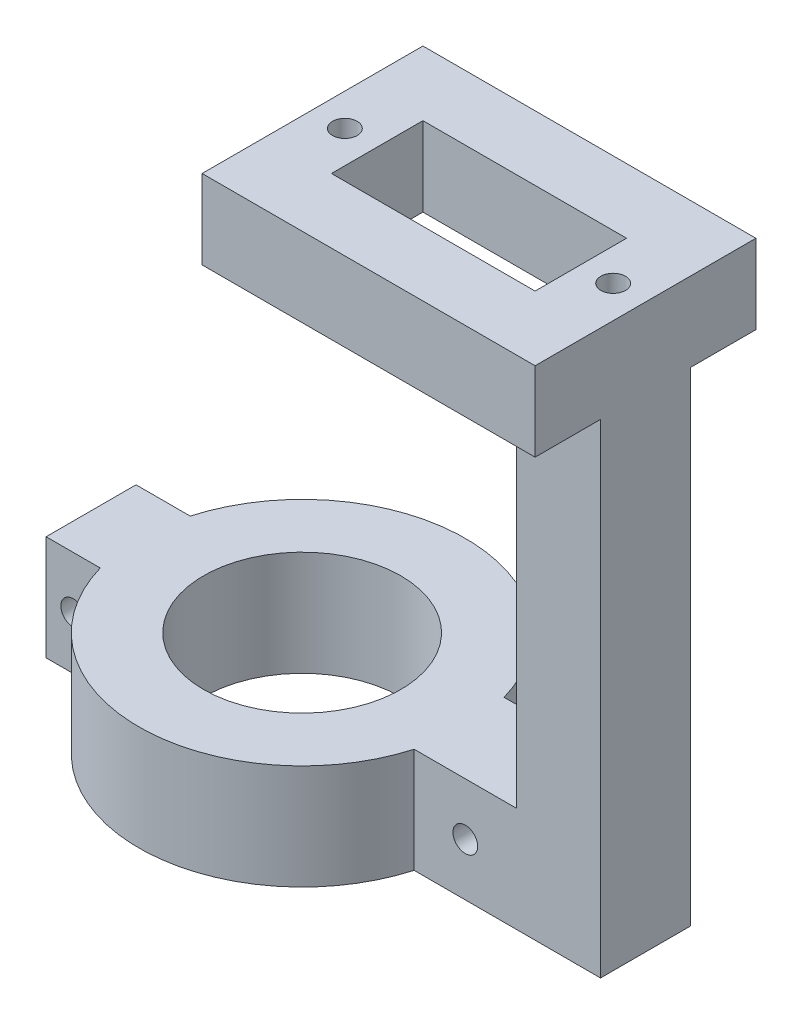
ISO-10303-21;
HEADER;
FILE_DESCRIPTION(('STEP AP214'),'2;1');
FILE_NAME('part.step','',(''),(''),'','','');
FILE_SCHEMA(('AUTOMOTIVE_DESIGN { 1 0 10303 214 1 1 1 1 }'));
ENDSEC;
DATA;
#1=APPLICATION_CONTEXT('core data for automotive mechanical design processes');
#2=APPLICATION_PROTOCOL_DEFINITION('international standard','automotive_design',2000,#1);
#3=PRODUCT_CONTEXT('',#1,'mechanical');
#4=PRODUCT('Part','Part','',(#3));
#5=PRODUCT_RELATED_PRODUCT_CATEGORY('part','',(#4));
#6=PRODUCT_DEFINITION_FORMATION('','',#4);
#7=PRODUCT_DEFINITION_CONTEXT('part definition',#1,'design');
#8=PRODUCT_DEFINITION('design','',#6,#7);
#9=PRODUCT_DEFINITION_SHAPE('','',#8);
#10=(LENGTH_UNIT() NAMED_UNIT(*) SI_UNIT(.MILLI.,.METRE.));
#11=(NAMED_UNIT(*) PLANE_ANGLE_UNIT() SI_UNIT($,.RADIAN.));
#12=(NAMED_UNIT(*) SI_UNIT($,.STERADIAN.) SOLID_ANGLE_UNIT());
#13=UNCERTAINTY_MEASURE_WITH_UNIT(LENGTH_MEASURE(1.E-05),#10,'distance_accuracy_value','');
#14=(GEOMETRIC_REPRESENTATION_CONTEXT(3) GLOBAL_UNCERTAINTY_ASSIGNED_CONTEXT((#13)) GLOBAL_UNIT_ASSIGNED_CONTEXT((#10,
#11,#12)) REPRESENTATION_CONTEXT('',''));
#15=CARTESIAN_POINT('',(0.,0.,0.));
#16=DIRECTION('',(0.,0.,1.));
#17=DIRECTION('',(1.,0.,0.));
#18=AXIS2_PLACEMENT_3D('',#15,#16,#17);
#19=CARTESIAN_POINT('',(-27.351479578733,-58.59,0.));
#20=DIRECTION('',(0.,-1.,0.));
#21=DIRECTION('',(0.,0.,-1.));
#22=AXIS2_PLACEMENT_3D('',#19,#20,#21);
#23=CYLINDRICAL_SURFACE('',#22,25.25);
#24=CARTESIAN_POINT('',(-27.351479578733,-74.82,0.));
#25=DIRECTION('',(0.,-1.,0.));
#26=DIRECTION('',(1.,0.,0.));
#27=AXIS2_PLACEMENT_3D('',#24,#25,#26);
#28=CIRCLE('',#27,25.25);
#29=CARTESIAN_POINT('',(-51.6247256533725,-74.82,-6.955));
#30=VERTEX_POINT('',#29);
#31=CARTESIAN_POINT('',(-3.07823350409353,-74.82,-6.955));
#32=VERTEX_POINT('',#31);
#33=EDGE_CURVE('E84',#30,#32,#28,.T.);
#34=ORIENTED_EDGE('',*,*,#33,.F.);
#35=DIRECTION('',(0.,-1.,0.));
#36=VECTOR('',#35,1.);
#37=CARTESIAN_POINT('',(-51.6247256533725,-58.59,-6.955));
#38=LINE('',#37,#36);
#39=CARTESIAN_POINT('',(-51.6247256533725,-58.59,-6.955));
#40=VERTEX_POINT('',#39);
#41=EDGE_CURVE('E12',#30,#40,#38,.F.);
#42=ORIENTED_EDGE('',*,*,#41,.T.);
#43=CARTESIAN_POINT('',(-27.351479578733,-58.59,0.));
#44=DIRECTION('',(0.,-1.,0.));
#45=DIRECTION('',(1.,0.,0.));
#46=AXIS2_PLACEMENT_3D('',#43,#44,#45);
#47=CIRCLE('',#46,25.25);
#48=CARTESIAN_POINT('',(-3.07823350409353,-58.59,-6.95500000000001));
#49=VERTEX_POINT('',#48);
#50=EDGE_CURVE('E202',#40,#49,#47,.T.);
#51=ORIENTED_EDGE('',*,*,#50,.T.);
#52=DIRECTION('',(0.,-1.,0.));
#53=VECTOR('',#52,1.);
#54=CARTESIAN_POINT('',(-3.07823350409353,-58.59,-6.955));
#55=LINE('',#54,#53);
#56=EDGE_CURVE('E246',#32,#49,#55,.F.);
#57=ORIENTED_EDGE('',*,*,#56,.F.);
#58=EDGE_LOOP('',(#34,#42,#51,#57));
#59=FACE_BOUND('',#58,.T.);
#60=ADVANCED_FACE('F63',(#59),#23,.T.);
#61=CARTESIAN_POINT('',(-3.07823350409353,-58.59,6.95499999999999));
#62=VERTEX_POINT('',#61);
#63=CARTESIAN_POINT('',(-51.6247256533725,-58.59,6.955));
#64=VERTEX_POINT('',#63);
#65=EDGE_CURVE('E238',#62,#64,#47,.T.);
#66=ORIENTED_EDGE('',*,*,#65,.T.);
#67=DIRECTION('',(0.,-1.,0.));
#68=VECTOR('',#67,1.);
#69=CARTESIAN_POINT('',(-51.6247256533725,-58.59,6.955));
#70=LINE('',#69,#68);
#71=CARTESIAN_POINT('',(-51.6247256533725,-74.82,6.955));
#72=VERTEX_POINT('',#71);
#73=EDGE_CURVE('E72',#64,#72,#70,.T.);
#74=ORIENTED_EDGE('',*,*,#73,.T.);
#75=CARTESIAN_POINT('',(-3.07823350409353,-74.82,6.955));
#76=VERTEX_POINT('',#75);
#77=EDGE_CURVE('E242',#76,#72,#28,.T.);
#78=ORIENTED_EDGE('',*,*,#77,.F.);
#79=DIRECTION('',(0.,-1.,0.));
#80=VECTOR('',#79,1.);
#81=CARTESIAN_POINT('',(-3.07823350409353,-58.59,6.955));
#82=LINE('',#81,#80);
#83=EDGE_CURVE('E241',#62,#76,#82,.T.);
#84=ORIENTED_EDGE('',*,*,#83,.F.);
#85=EDGE_LOOP('',(#66,#74,#78,#84));
#86=FACE_BOUND('',#85,.T.);
#87=ADVANCED_FACE('F382',(#86),#23,.T.);
#88=CARTESIAN_POINT('',(12.75,-74.82,6.955));
#89=DIRECTION('',(1.,0.,0.));
#90=DIRECTION('',(0.,0.,-1.));
#91=AXIS2_PLACEMENT_3D('',#88,#89,#90);
#92=PLANE('',#91);
#93=DIRECTION('',(0.,0.,-1.));
#94=VECTOR('',#93,1.);
#95=CARTESIAN_POINT('',(12.75,-58.59,-6.955));
#96=LINE('',#95,#94);
#97=CARTESIAN_POINT('',(12.75,-58.59,6.955));
#98=VERTEX_POINT('',#97);
#99=CARTESIAN_POINT('',(12.75,-58.59,-6.955));
#100=VERTEX_POINT('',#99);
#101=EDGE_CURVE('E249',#98,#100,#96,.T.);
#102=ORIENTED_EDGE('',*,*,#101,.F.);
#103=DIRECTION('',(0.,1.,0.));
#104=VECTOR('',#103,1.);
#105=CARTESIAN_POINT('',(12.75,-74.82,6.955));
#106=LINE('',#105,#104);
#107=CARTESIAN_POINT('',(12.75,0.,6.955));
#108=VERTEX_POINT('',#107);
#109=EDGE_CURVE('E280',#98,#108,#106,.T.);
#110=ORIENTED_EDGE('',*,*,#109,.T.);
#111=DIRECTION('',(0.,0.,-1.));
#112=VECTOR('',#111,1.);
#113=CARTESIAN_POINT('',(12.75,0.,6.955));
#114=LINE('',#113,#112);
#115=CARTESIAN_POINT('',(12.75,0.,-6.955));
#116=VERTEX_POINT('',#115);
#117=EDGE_CURVE('E270',#108,#116,#114,.T.);
#118=ORIENTED_EDGE('',*,*,#117,.T.);
#119=DIRECTION('',(0.,1.,0.));
#120=VECTOR('',#119,1.);
#121=CARTESIAN_POINT('',(12.75,-74.82,-6.955));
#122=LINE('',#121,#120);
#123=EDGE_CURVE('E278',#100,#116,#122,.T.);
#124=ORIENTED_EDGE('',*,*,#123,.F.);
#125=EDGE_LOOP('',(#102,#110,#118,#124));
#126=FACE_BOUND('',#125,.T.);
#127=ADVANCED_FACE('F387',(#126),#92,.F.);
#128=CARTESIAN_POINT('',(0.,0.,0.));
#129=DIRECTION('',(0.,1.,0.));
#130=DIRECTION('',(0.,0.,1.));
#131=AXIS2_PLACEMENT_3D('',#128,#129,#130);
#132=PLANE('',#131);
#133=CARTESIAN_POINT('',(-20.75,0.,0.));
#134=DIRECTION('',(0.,1.,0.));
#135=DIRECTION('',(0.,0.,1.));
#136=AXIS2_PLACEMENT_3D('',#133,#134,#135);
#137=CIRCLE('',#136,1.91);
#138=CARTESIAN_POINT('',(-20.75,0.,1.91));
#139=VERTEX_POINT('',#138);
#140=EDGE_CURVE('E292',#139,#139,#137,.T.);
#141=ORIENTED_EDGE('',*,*,#140,.T.);
#142=EDGE_LOOP('',(#141));
#143=FACE_BOUND('',#142,.T.);
#144=DIRECTION('',(1.,0.,0.));
#145=VECTOR('',#144,1.);
#146=CARTESIAN_POINT('',(12.75,0.,-6.955));
#147=LINE('',#146,#145);
#148=CARTESIAN_POINT('',(15.75,0.,-6.955));
#149=VERTEX_POINT('',#148);
#150=CARTESIAN_POINT('',(25.75,0.,-6.955));
#151=VERTEX_POINT('',#150);
#152=EDGE_CURVE('E275',#149,#151,#147,.T.);
#153=ORIENTED_EDGE('',*,*,#152,.F.);
#154=DIRECTION('',(0.,0.,-1.));
#155=VECTOR('',#154,1.);
#156=CARTESIAN_POINT('',(15.75,0.,-7.075));
#157=LINE('',#156,#155);
#158=CARTESIAN_POINT('',(15.75,0.,-7.075));
#159=VERTEX_POINT('',#158);
#160=EDGE_CURVE('E295',#149,#159,#157,.T.);
#161=ORIENTED_EDGE('',*,*,#160,.T.);
#162=DIRECTION('',(-1.,0.,0.));
#163=VECTOR('',#162,1.);
#164=CARTESIAN_POINT('',(-15.75,0.,-7.075));
#165=LINE('',#164,#163);
#166=CARTESIAN_POINT('',(-15.75,0.,-7.075));
#167=VERTEX_POINT('',#166);
#168=EDGE_CURVE('E311',#159,#167,#165,.T.);
#169=ORIENTED_EDGE('',*,*,#168,.T.);
#170=DIRECTION('',(0.,0.,1.));
#171=VECTOR('',#170,1.);
#172=CARTESIAN_POINT('',(-15.75,0.,-7.075));
#173=LINE('',#172,#171);
#174=CARTESIAN_POINT('',(-15.75,0.,7.075));
#175=VERTEX_POINT('',#174);
#176=EDGE_CURVE('E315',#167,#175,#173,.T.);
#177=ORIENTED_EDGE('',*,*,#176,.T.);
#178=DIRECTION('',(1.,0.,0.));
#179=VECTOR('',#178,1.);
#180=CARTESIAN_POINT('',(-15.75,0.,7.075));
#181=LINE('',#180,#179);
#182=CARTESIAN_POINT('',(15.75,0.,7.075));
#183=VERTEX_POINT('',#182);
#184=EDGE_CURVE('E301',#175,#183,#181,.T.);
#185=ORIENTED_EDGE('',*,*,#184,.T.);
#186=CARTESIAN_POINT('',(15.75,0.,6.955));
#187=VERTEX_POINT('',#186);
#188=EDGE_CURVE('E309',#183,#187,#157,.T.);
#189=ORIENTED_EDGE('',*,*,#188,.T.);
#190=DIRECTION('',(-1.,0.,0.));
#191=VECTOR('',#190,1.);
#192=CARTESIAN_POINT('',(12.75,0.,6.955));
#193=LINE('',#192,#191);
#194=CARTESIAN_POINT('',(25.75,0.,6.955));
#195=VERTEX_POINT('',#194);
#196=EDGE_CURVE('E267',#195,#187,#193,.T.);
#197=ORIENTED_EDGE('',*,*,#196,.F.);
#198=DIRECTION('',(0.,0.,-1.));
#199=VECTOR('',#198,1.);
#200=CARTESIAN_POINT('',(25.75,0.,-7.075));
#201=LINE('',#200,#199);
#202=CARTESIAN_POINT('',(25.75,0.,17.075));
#203=VERTEX_POINT('',#202);
#204=EDGE_CURVE('E341',#203,#195,#201,.T.);
#205=ORIENTED_EDGE('',*,*,#204,.F.);
#206=DIRECTION('',(1.,0.,0.));
#207=VECTOR('',#206,1.);
#208=CARTESIAN_POINT('',(-15.75,0.,17.075));
#209=LINE('',#208,#207);
#210=CARTESIAN_POINT('',(-25.75,0.,17.075));
#211=VERTEX_POINT('',#210);
#212=EDGE_CURVE('E334',#211,#203,#209,.T.);
#213=ORIENTED_EDGE('',*,*,#212,.F.);
#214=DIRECTION('',(0.,0.,1.));
#215=VECTOR('',#214,1.);
#216=CARTESIAN_POINT('',(-25.75,0.,-7.075));
#217=LINE('',#216,#215);
#218=CARTESIAN_POINT('',(-25.75,0.,-17.075));
#219=VERTEX_POINT('',#218);
#220=EDGE_CURVE('E346',#219,#211,#217,.T.);
#221=ORIENTED_EDGE('',*,*,#220,.F.);
#222=DIRECTION('',(-1.,0.,0.));
#223=VECTOR('',#222,1.);
#224=CARTESIAN_POINT('',(-15.75,0.,-17.075));
#225=LINE('',#224,#223);
#226=CARTESIAN_POINT('',(25.75,0.,-17.075));
#227=VERTEX_POINT('',#226);
#228=EDGE_CURVE('E344',#227,#219,#225,.T.);
#229=ORIENTED_EDGE('',*,*,#228,.F.);
#230=EDGE_CURVE('E329',#151,#227,#201,.T.);
#231=ORIENTED_EDGE('',*,*,#230,.F.);
#232=EDGE_LOOP('',(#153,#161,#169,#177,#185,#189,#197,#205,#213,#221,#229,#231));
#233=FACE_BOUND('',#232,.T.);
#234=ADVANCED_FACE('F408',(#143,#233),#132,.F.);
#235=CARTESIAN_POINT('',(0.,12.25,0.));
#236=DIRECTION('',(0.,1.,0.));
#237=DIRECTION('',(0.,0.,1.));
#238=AXIS2_PLACEMENT_3D('',#235,#236,#237);
#239=PLANE('',#238);
#240=CARTESIAN_POINT('',(20.75,12.25,0.));
#241=DIRECTION('',(0.,1.,0.));
#242=DIRECTION('',(0.,0.,1.));
#243=AXIS2_PLACEMENT_3D('',#240,#241,#242);
#244=CIRCLE('',#243,1.91);
#245=CARTESIAN_POINT('',(20.75,12.25,1.91));
#246=VERTEX_POINT('',#245);
#247=EDGE_CURVE('E285',#246,#246,#244,.T.);
#248=ORIENTED_EDGE('',*,*,#247,.F.);
#249=EDGE_LOOP('',(#248));
#250=FACE_BOUND('',#249,.T.);
#251=CARTESIAN_POINT('',(-20.75,12.25,0.));
#252=DIRECTION('',(0.,1.,0.));
#253=DIRECTION('',(0.,0.,1.));
#254=AXIS2_PLACEMENT_3D('',#251,#252,#253);
#255=CIRCLE('',#254,1.91);
#256=CARTESIAN_POINT('',(-20.75,12.25,1.91));
#257=VERTEX_POINT('',#256);
#258=EDGE_CURVE('E289',#257,#257,#255,.T.);
#259=ORIENTED_EDGE('',*,*,#258,.F.);
#260=EDGE_LOOP('',(#259));
#261=FACE_BOUND('',#260,.T.);
#262=DIRECTION('',(0.,0.,-1.));
#263=VECTOR('',#262,1.);
#264=CARTESIAN_POINT('',(25.75,12.25,-7.075));
#265=LINE('',#264,#263);
#266=CARTESIAN_POINT('',(25.75,12.25,17.075));
#267=VERTEX_POINT('',#266);
#268=CARTESIAN_POINT('',(25.75,12.25,-17.075));
#269=VERTEX_POINT('',#268);
#270=EDGE_CURVE('E330',#267,#269,#265,.T.);
#271=ORIENTED_EDGE('',*,*,#270,.T.);
#272=DIRECTION('',(-1.,0.,0.));
#273=VECTOR('',#272,1.);
#274=CARTESIAN_POINT('',(-15.75,12.25,-17.075));
#275=LINE('',#274,#273);
#276=CARTESIAN_POINT('',(-25.75,12.25,-17.075));
#277=VERTEX_POINT('',#276);
#278=EDGE_CURVE('E333',#269,#277,#275,.T.);
#279=ORIENTED_EDGE('',*,*,#278,.T.);
#280=DIRECTION('',(0.,0.,1.));
#281=VECTOR('',#280,1.);
#282=CARTESIAN_POINT('',(-25.75,12.25,-7.075));
#283=LINE('',#282,#281);
#284=CARTESIAN_POINT('',(-25.75,12.25,17.075));
#285=VERTEX_POINT('',#284);
#286=EDGE_CURVE('E336',#277,#285,#283,.T.);
#287=ORIENTED_EDGE('',*,*,#286,.T.);
#288=DIRECTION('',(1.,0.,0.));
#289=VECTOR('',#288,1.);
#290=CARTESIAN_POINT('',(-15.75,12.25,17.075));
#291=LINE('',#290,#289);
#292=EDGE_CURVE('E338',#285,#267,#291,.T.);
#293=ORIENTED_EDGE('',*,*,#292,.T.);
#294=EDGE_LOOP('',(#271,#279,#287,#293));
#295=FACE_BOUND('',#294,.T.);
#296=DIRECTION('',(-1.,0.,0.));
#297=VECTOR('',#296,1.);
#298=CARTESIAN_POINT('',(-15.75,12.25,-7.075));
#299=LINE('',#298,#297);
#300=CARTESIAN_POINT('',(15.75,12.25,-7.075));
#301=VERTEX_POINT('',#300);
#302=CARTESIAN_POINT('',(-15.75,12.25,-7.075));
#303=VERTEX_POINT('',#302);
#304=EDGE_CURVE('E300',#301,#303,#299,.T.);
#305=ORIENTED_EDGE('',*,*,#304,.F.);
#306=DIRECTION('',(0.,0.,-1.));
#307=VECTOR('',#306,1.);
#308=CARTESIAN_POINT('',(15.75,12.25,-7.075));
#309=LINE('',#308,#307);
#310=CARTESIAN_POINT('',(15.75,12.25,7.075));
#311=VERTEX_POINT('',#310);
#312=EDGE_CURVE('E298',#311,#301,#309,.T.);
#313=ORIENTED_EDGE('',*,*,#312,.F.);
#314=DIRECTION('',(1.,0.,0.));
#315=VECTOR('',#314,1.);
#316=CARTESIAN_POINT('',(-15.75,12.25,7.075));
#317=LINE('',#316,#315);
#318=CARTESIAN_POINT('',(-15.75,12.25,7.075));
#319=VERTEX_POINT('',#318);
#320=EDGE_CURVE('E306',#319,#311,#317,.T.);
#321=ORIENTED_EDGE('',*,*,#320,.F.);
#322=DIRECTION('',(0.,0.,1.));
#323=VECTOR('',#322,1.);
#324=CARTESIAN_POINT('',(-15.75,12.25,-7.075));
#325=LINE('',#324,#323);
#326=EDGE_CURVE('E303',#303,#319,#325,.T.);
#327=ORIENTED_EDGE('',*,*,#326,.F.);
#328=EDGE_LOOP('',(#305,#313,#321,#327));
#329=FACE_BOUND('',#328,.T.);
#330=ADVANCED_FACE('F437',(#250,#261,#295,#329),#239,.T.);
#331=CARTESIAN_POINT('',(25.75,12.25,-7.075));
#332=DIRECTION('',(-1.,0.,0.));
#333=DIRECTION('',(0.,0.,1.));
#334=AXIS2_PLACEMENT_3D('',#331,#332,#333);
#335=PLANE('',#334);
#336=ORIENTED_EDGE('',*,*,#204,.T.);
#337=DIRECTION('',(0.,1.,0.));
#338=VECTOR('',#337,1.);
#339=CARTESIAN_POINT('',(25.75,-74.82,6.955));
#340=LINE('',#339,#338);
#341=CARTESIAN_POINT('',(25.75,-74.82,6.955));
#342=VERTEX_POINT('',#341);
#343=EDGE_CURVE('E282',#342,#195,#340,.T.);
#344=ORIENTED_EDGE('',*,*,#343,.F.);
#345=DIRECTION('',(0.,0.,1.));
#346=VECTOR('',#345,1.);
#347=CARTESIAN_POINT('',(25.75,-74.82,6.955));
#348=LINE('',#347,#346);
#349=CARTESIAN_POINT('',(25.75,-74.82,-6.955));
#350=VERTEX_POINT('',#349);
#351=EDGE_CURVE('E257',#350,#342,#348,.T.);
#352=ORIENTED_EDGE('',*,*,#351,.F.);
#353=DIRECTION('',(0.,1.,0.));
#354=VECTOR('',#353,1.);
#355=CARTESIAN_POINT('',(25.75,-74.82,-6.955));
#356=LINE('',#355,#354);
#357=EDGE_CURVE('E266',#350,#151,#356,.T.);
#358=ORIENTED_EDGE('',*,*,#357,.T.);
#359=ORIENTED_EDGE('',*,*,#230,.T.);
#360=DIRECTION('',(0.,-1.,0.));
#361=VECTOR('',#360,1.);
#362=CARTESIAN_POINT('',(25.75,12.25,-17.075));
#363=LINE('',#362,#361);
#364=EDGE_CURVE('E357',#269,#227,#363,.T.);
#365=ORIENTED_EDGE('',*,*,#364,.F.);
#366=ORIENTED_EDGE('',*,*,#270,.F.);
#367=DIRECTION('',(0.,-1.,0.));
#368=VECTOR('',#367,1.);
#369=CARTESIAN_POINT('',(25.75,12.25,17.075));
#370=LINE('',#369,#368);
#371=EDGE_CURVE('E340',#267,#203,#370,.T.);
#372=ORIENTED_EDGE('',*,*,#371,.T.);
#373=EDGE_LOOP('',(#336,#344,#352,#358,#359,#365,#366,#372));
#374=FACE_BOUND('',#373,.T.);
#375=ADVANCED_FACE('F65',(#374),#335,.F.);
#376=CARTESIAN_POINT('',(-15.75,12.25,-17.075));
#377=DIRECTION('',(0.,0.,1.));
#378=DIRECTION('',(1.,0.,0.));
#379=AXIS2_PLACEMENT_3D('',#376,#377,#378);
#380=PLANE('',#379);
#381=ORIENTED_EDGE('',*,*,#228,.T.);
#382=DIRECTION('',(0.,-1.,0.));
#383=VECTOR('',#382,1.);
#384=CARTESIAN_POINT('',(-25.75,12.25,-17.075));
#385=LINE('',#384,#383);
#386=EDGE_CURVE('E354',#277,#219,#385,.T.);
#387=ORIENTED_EDGE('',*,*,#386,.F.);
#388=ORIENTED_EDGE('',*,*,#278,.F.);
#389=ORIENTED_EDGE('',*,*,#364,.T.);
#390=EDGE_LOOP('',(#381,#387,#388,#389));
#391=FACE_BOUND('',#390,.T.);
#392=ADVANCED_FACE('F449',(#391),#380,.F.);
#393=CARTESIAN_POINT('',(-25.75,12.25,-7.075));
#394=DIRECTION('',(1.,0.,0.));
#395=DIRECTION('',(0.,0.,-1.));
#396=AXIS2_PLACEMENT_3D('',#393,#394,#395);
#397=PLANE('',#396);
#398=ORIENTED_EDGE('',*,*,#220,.T.);
#399=DIRECTION('',(0.,-1.,0.));
#400=VECTOR('',#399,1.);
#401=CARTESIAN_POINT('',(-25.75,12.25,17.075));
#402=LINE('',#401,#400);
#403=EDGE_CURVE('E351',#285,#211,#402,.T.);
#404=ORIENTED_EDGE('',*,*,#403,.F.);
#405=ORIENTED_EDGE('',*,*,#286,.F.);
#406=ORIENTED_EDGE('',*,*,#386,.T.);
#407=EDGE_LOOP('',(#398,#404,#405,#406));
#408=FACE_BOUND('',#407,.T.);
#409=ADVANCED_FACE('F446',(#408),#397,.F.);
#410=CARTESIAN_POINT('',(-15.75,12.25,17.075));
#411=DIRECTION('',(0.,0.,-1.));
#412=DIRECTION('',(-1.,0.,0.));
#413=AXIS2_PLACEMENT_3D('',#410,#411,#412);
#414=PLANE('',#413);
#415=ORIENTED_EDGE('',*,*,#212,.T.);
#416=ORIENTED_EDGE('',*,*,#371,.F.);
#417=ORIENTED_EDGE('',*,*,#292,.F.);
#418=ORIENTED_EDGE('',*,*,#403,.T.);
#419=EDGE_LOOP('',(#415,#416,#417,#418));
#420=FACE_BOUND('',#419,.T.);
#421=ADVANCED_FACE('F435',(#420),#414,.F.);
#422=CARTESIAN_POINT('',(15.75,12.25,-7.075));
#423=DIRECTION('',(-1.,0.,0.));
#424=DIRECTION('',(0.,0.,1.));
#425=AXIS2_PLACEMENT_3D('',#422,#423,#424);
#426=PLANE('',#425);
#427=ORIENTED_EDGE('',*,*,#188,.F.);
#428=DIRECTION('',(0.,-1.,0.));
#429=VECTOR('',#428,1.);
#430=CARTESIAN_POINT('',(15.75,12.25,7.075));
#431=LINE('',#430,#429);
#432=EDGE_CURVE('E308',#311,#183,#431,.T.);
#433=ORIENTED_EDGE('',*,*,#432,.F.);
#434=ORIENTED_EDGE('',*,*,#312,.T.);
#435=DIRECTION('',(0.,-1.,0.));
#436=VECTOR('',#435,1.);
#437=CARTESIAN_POINT('',(15.75,12.25,-7.075));
#438=LINE('',#437,#436);
#439=EDGE_CURVE('E326',#301,#159,#438,.T.);
#440=ORIENTED_EDGE('',*,*,#439,.T.);
#441=ORIENTED_EDGE('',*,*,#160,.F.);
#442=EDGE_CURVE('E312',#187,#149,#157,.T.);
#443=ORIENTED_EDGE('',*,*,#442,.F.);
#444=EDGE_LOOP('',(#427,#433,#434,#440,#441,#443));
#445=FACE_BOUND('',#444,.T.);
#446=ADVANCED_FACE('F431',(#445),#426,.T.);
#447=CARTESIAN_POINT('',(-15.75,12.25,-7.075));
#448=DIRECTION('',(0.,0.,1.));
#449=DIRECTION('',(1.,0.,0.));
#450=AXIS2_PLACEMENT_3D('',#447,#448,#449);
#451=PLANE('',#450);
#452=ORIENTED_EDGE('',*,*,#168,.F.);
#453=ORIENTED_EDGE('',*,*,#439,.F.);
#454=ORIENTED_EDGE('',*,*,#304,.T.);
#455=DIRECTION('',(0.,-1.,0.));
#456=VECTOR('',#455,1.);
#457=CARTESIAN_POINT('',(-15.75,12.25,-7.075));
#458=LINE('',#457,#456);
#459=EDGE_CURVE('E324',#303,#167,#458,.T.);
#460=ORIENTED_EDGE('',*,*,#459,.T.);
#461=EDGE_LOOP('',(#452,#453,#454,#460));
#462=FACE_BOUND('',#461,.T.);
#463=ADVANCED_FACE('F427',(#462),#451,.T.);
#464=CARTESIAN_POINT('',(-15.75,12.25,-7.075));
#465=DIRECTION('',(1.,0.,0.));
#466=DIRECTION('',(0.,0.,-1.));
#467=AXIS2_PLACEMENT_3D('',#464,#465,#466);
#468=PLANE('',#467);
#469=ORIENTED_EDGE('',*,*,#176,.F.);
#470=ORIENTED_EDGE('',*,*,#459,.F.);
#471=ORIENTED_EDGE('',*,*,#326,.T.);
#472=DIRECTION('',(0.,-1.,0.));
#473=VECTOR('',#472,1.);
#474=CARTESIAN_POINT('',(-15.75,12.25,7.075));
#475=LINE('',#474,#473);
#476=EDGE_CURVE('E322',#319,#175,#475,.T.);
#477=ORIENTED_EDGE('',*,*,#476,.T.);
#478=EDGE_LOOP('',(#469,#470,#471,#477));
#479=FACE_BOUND('',#478,.T.);
#480=ADVANCED_FACE('F423',(#479),#468,.T.);
#481=CARTESIAN_POINT('',(-15.75,12.25,7.075));
#482=DIRECTION('',(0.,0.,-1.));
#483=DIRECTION('',(-1.,0.,0.));
#484=AXIS2_PLACEMENT_3D('',#481,#482,#483);
#485=PLANE('',#484);
#486=ORIENTED_EDGE('',*,*,#184,.F.);
#487=ORIENTED_EDGE('',*,*,#476,.F.);
#488=ORIENTED_EDGE('',*,*,#320,.T.);
#489=ORIENTED_EDGE('',*,*,#432,.T.);
#490=EDGE_LOOP('',(#486,#487,#488,#489));
#491=FACE_BOUND('',#490,.T.);
#492=ADVANCED_FACE('F419',(#491),#485,.T.);
#493=CARTESIAN_POINT('',(-20.75,0.,0.));
#494=DIRECTION('',(0.,1.,0.));
#495=DIRECTION('',(0.,0.,1.));
#496=AXIS2_PLACEMENT_3D('',#493,#494,#495);
#497=CYLINDRICAL_SURFACE('',#496,1.91);
#498=ORIENTED_EDGE('',*,*,#140,.F.);
#499=EDGE_LOOP('',(#498));
#500=FACE_BOUND('',#499,.T.);
#501=ORIENTED_EDGE('',*,*,#258,.T.);
#502=EDGE_LOOP('',(#501));
#503=FACE_BOUND('',#502,.T.);
#504=ADVANCED_FACE('F415',(#500,#503),#497,.F.);
#505=CARTESIAN_POINT('',(20.75,0.,0.));
#506=DIRECTION('',(0.,1.,0.));
#507=DIRECTION('',(0.,0.,1.));
#508=AXIS2_PLACEMENT_3D('',#505,#506,#507);
#509=CYLINDRICAL_SURFACE('',#508,1.91);
#510=CARTESIAN_POINT('',(20.75,0.,0.));
#511=DIRECTION('',(0.,1.,0.));
#512=DIRECTION('',(0.,0.,1.));
#513=AXIS2_PLACEMENT_3D('',#510,#511,#512);
#514=CIRCLE('',#513,1.91);
#515=CARTESIAN_POINT('',(20.75,0.,1.91));
#516=VERTEX_POINT('',#515);
#517=EDGE_CURVE('E286',#516,#516,#514,.T.);
#518=ORIENTED_EDGE('',*,*,#517,.F.);
#519=EDGE_LOOP('',(#518));
#520=FACE_BOUND('',#519,.T.);
#521=ORIENTED_EDGE('',*,*,#247,.T.);
#522=EDGE_LOOP('',(#521));
#523=FACE_BOUND('',#522,.T.);
#524=ADVANCED_FACE('F397',(#520,#523),#509,.F.);
#525=CARTESIAN_POINT('',(0.,-74.82,0.));
#526=DIRECTION('',(0.,-1.,0.));
#527=DIRECTION('',(0.,0.,-1.));
#528=AXIS2_PLACEMENT_3D('',#525,#526,#527);
#529=PLANE('',#528);
#530=DIRECTION('',(-1.,0.,0.));
#531=VECTOR('',#530,1.);
#532=CARTESIAN_POINT('',(-50.,-74.82,-6.955));
#533=LINE('',#532,#531);
#534=CARTESIAN_POINT('',(-60.,-74.82,-6.955));
#535=VERTEX_POINT('',#534);
#536=EDGE_CURVE('E79',#30,#535,#533,.T.);
#537=ORIENTED_EDGE('',*,*,#536,.F.);
#538=ORIENTED_EDGE('',*,*,#33,.T.);
#539=DIRECTION('',(1.,0.,0.));
#540=VECTOR('',#539,1.);
#541=CARTESIAN_POINT('',(12.75,-74.82,-6.955));
#542=LINE('',#541,#540);
#543=EDGE_CURVE('E264',#32,#350,#542,.T.);
#544=ORIENTED_EDGE('',*,*,#543,.T.);
#545=ORIENTED_EDGE('',*,*,#351,.T.);
#546=DIRECTION('',(-1.,0.,0.));
#547=VECTOR('',#546,1.);
#548=CARTESIAN_POINT('',(12.75,-74.82,6.955));
#549=LINE('',#548,#547);
#550=EDGE_CURVE('E260',#342,#76,#549,.T.);
#551=ORIENTED_EDGE('',*,*,#550,.T.);
#552=ORIENTED_EDGE('',*,*,#77,.T.);
#553=DIRECTION('',(-1.,0.,0.));
#554=VECTOR('',#553,1.);
#555=CARTESIAN_POINT('',(-50.,-74.82,6.955));
#556=LINE('',#555,#554);
#557=CARTESIAN_POINT('',(-60.,-74.82,6.955));
#558=VERTEX_POINT('',#557);
#559=EDGE_CURVE('E226',#72,#558,#556,.T.);
#560=ORIENTED_EDGE('',*,*,#559,.T.);
#561=DIRECTION('',(0.,0.,-1.));
#562=VECTOR('',#561,1.);
#563=CARTESIAN_POINT('',(-60.,-74.82,-6.955));
#564=LINE('',#563,#562);
#565=EDGE_CURVE('E223',#558,#535,#564,.T.);
#566=ORIENTED_EDGE('',*,*,#565,.T.);
#567=EDGE_LOOP('',(#537,#538,#544,#545,#551,#552,#560,#566));
#568=FACE_BOUND('',#567,.T.);
#569=CARTESIAN_POINT('',(-27.351479578733,-74.82,0.));
#570=DIRECTION('',(0.,-1.,0.));
#571=DIRECTION('',(0.,0.,-1.));
#572=AXIS2_PLACEMENT_3D('',#569,#570,#571);
#573=CIRCLE('',#572,15.25);
#574=CARTESIAN_POINT('',(-27.351479578733,-74.82,-15.25));
#575=VERTEX_POINT('',#574);
#576=EDGE_CURVE('E235',#575,#575,#573,.T.);
#577=ORIENTED_EDGE('',*,*,#576,.F.);
#578=EDGE_LOOP('',(#577));
#579=FACE_BOUND('',#578,.T.);
#580=ADVANCED_FACE('F377',(#568,#579),#529,.T.);
#581=CARTESIAN_POINT('',(12.75,-74.82,-6.955));
#582=DIRECTION('',(0.,0.,1.));
#583=DIRECTION('',(1.,0.,0.));
#584=AXIS2_PLACEMENT_3D('',#581,#582,#583);
#585=PLANE('',#584);
#586=CARTESIAN_POINT('',(4.83588324795129,-66.7050000000066,-6.955));
#587=DIRECTION('',(0.,0.,-1.));
#588=DIRECTION('',(-1.,0.,0.));
#589=AXIS2_PLACEMENT_3D('',#586,#587,#588);
#590=CIRCLE('',#589,1.91);
#591=CARTESIAN_POINT('',(2.92588324795129,-66.7050000000066,-6.955));
#592=VERTEX_POINT('',#591);
#593=EDGE_CURVE('E205',#592,#592,#590,.T.);
#594=ORIENTED_EDGE('',*,*,#593,.F.);
#595=EDGE_LOOP('',(#594));
#596=FACE_BOUND('',#595,.T.);
#597=ORIENTED_EDGE('',*,*,#543,.F.);
#598=ORIENTED_EDGE('',*,*,#56,.T.);
#599=DIRECTION('',(1.,0.,0.));
#600=VECTOR('',#599,1.);
#601=CARTESIAN_POINT('',(-3.25,-58.59,-6.95500000000001));
#602=LINE('',#601,#600);
#603=EDGE_CURVE('E252',#49,#100,#602,.T.);
#604=ORIENTED_EDGE('',*,*,#603,.T.);
#605=ORIENTED_EDGE('',*,*,#123,.T.);
#606=EDGE_CURVE('E261',#116,#149,#147,.T.);
#607=ORIENTED_EDGE('',*,*,#606,.T.);
#608=ORIENTED_EDGE('',*,*,#152,.T.);
#609=ORIENTED_EDGE('',*,*,#357,.F.);
#610=EDGE_LOOP('',(#597,#598,#604,#605,#607,#608,#609));
#611=FACE_BOUND('',#610,.T.);
#612=ADVANCED_FACE('F368',(#596,#611),#585,.F.);
#613=CARTESIAN_POINT('',(12.75,-74.82,6.955));
#614=DIRECTION('',(0.,0.,-1.));
#615=DIRECTION('',(-1.,0.,0.));
#616=AXIS2_PLACEMENT_3D('',#613,#614,#615);
#617=PLANE('',#616);
#618=CARTESIAN_POINT('',(4.83588324795129,-66.7050000000066,6.955));
#619=DIRECTION('',(0.,0.,-1.));
#620=DIRECTION('',(-1.,0.,0.));
#621=AXIS2_PLACEMENT_3D('',#618,#619,#620);
#622=CIRCLE('',#621,1.91);
#623=CARTESIAN_POINT('',(2.92588324795129,-66.7050000000066,6.955));
#624=VERTEX_POINT('',#623);
#625=EDGE_CURVE('E231',#624,#624,#622,.T.);
#626=ORIENTED_EDGE('',*,*,#625,.T.);
#627=EDGE_LOOP('',(#626));
#628=FACE_BOUND('',#627,.T.);
#629=DIRECTION('',(1.,0.,0.));
#630=VECTOR('',#629,1.);
#631=CARTESIAN_POINT('',(-3.25,-58.59,6.95499999999999));
#632=LINE('',#631,#630);
#633=EDGE_CURVE('E254',#62,#98,#632,.T.);
#634=ORIENTED_EDGE('',*,*,#633,.F.);
#635=ORIENTED_EDGE('',*,*,#83,.T.);
#636=ORIENTED_EDGE('',*,*,#550,.F.);
#637=ORIENTED_EDGE('',*,*,#343,.T.);
#638=ORIENTED_EDGE('',*,*,#196,.T.);
#639=EDGE_CURVE('E256',#187,#108,#193,.T.);
#640=ORIENTED_EDGE('',*,*,#639,.T.);
#641=ORIENTED_EDGE('',*,*,#109,.F.);
#642=EDGE_LOOP('',(#634,#635,#636,#637,#638,#640,#641));
#643=FACE_BOUND('',#642,.T.);
#644=ADVANCED_FACE('F404',(#628,#643),#617,.F.);
#645=CARTESIAN_POINT('',(0.,0.,0.));
#646=DIRECTION('',(0.,-1.,0.));
#647=DIRECTION('',(0.,0.,-1.));
#648=AXIS2_PLACEMENT_3D('',#645,#646,#647);
#649=PLANE('',#648);
#650=ORIENTED_EDGE('',*,*,#639,.F.);
#651=ORIENTED_EDGE('',*,*,#442,.T.);
#652=ORIENTED_EDGE('',*,*,#606,.F.);
#653=ORIENTED_EDGE('',*,*,#117,.F.);
#654=EDGE_LOOP('',(#650,#651,#652,#653));
#655=FACE_BOUND('',#654,.T.);
#656=ADVANCED_FACE('F400',(#655),#649,.F.);
#657=ORIENTED_EDGE('',*,*,#517,.T.);
#658=EDGE_LOOP('',(#657));
#659=FACE_BOUND('',#658,.T.);
#660=ADVANCED_FACE('F394',(#659),#649,.F.);
#661=CARTESIAN_POINT('',(-3.25,-58.59,-6.95500000000001));
#662=DIRECTION('',(0.,-1.,0.));
#663=DIRECTION('',(0.,0.,-1.));
#664=AXIS2_PLACEMENT_3D('',#661,#662,#663);
#665=PLANE('',#664);
#666=ORIENTED_EDGE('',*,*,#50,.F.);
#667=DIRECTION('',(-1.,0.,0.));
#668=VECTOR('',#667,1.);
#669=CARTESIAN_POINT('',(-50.,-58.59,-6.955));
#670=LINE('',#669,#668);
#671=CARTESIAN_POINT('',(-60.,-58.59,-6.955));
#672=VERTEX_POINT('',#671);
#673=EDGE_CURVE('E194',#40,#672,#670,.T.);
#674=ORIENTED_EDGE('',*,*,#673,.T.);
#675=DIRECTION('',(0.,0.,1.));
#676=VECTOR('',#675,1.);
#677=CARTESIAN_POINT('',(-60.,-58.59,-6.955));
#678=LINE('',#677,#676);
#679=CARTESIAN_POINT('',(-60.,-58.59,6.955));
#680=VERTEX_POINT('',#679);
#681=EDGE_CURVE('E199',#672,#680,#678,.T.);
#682=ORIENTED_EDGE('',*,*,#681,.T.);
#683=DIRECTION('',(-1.,0.,0.));
#684=VECTOR('',#683,1.);
#685=CARTESIAN_POINT('',(-50.,-58.59,6.955));
#686=LINE('',#685,#684);
#687=EDGE_CURVE('E206',#64,#680,#686,.T.);
#688=ORIENTED_EDGE('',*,*,#687,.F.);
#689=ORIENTED_EDGE('',*,*,#65,.F.);
#690=ORIENTED_EDGE('',*,*,#633,.T.);
#691=ORIENTED_EDGE('',*,*,#101,.T.);
#692=ORIENTED_EDGE('',*,*,#603,.F.);
#693=EDGE_LOOP('',(#666,#674,#682,#688,#689,#690,#691,#692));
#694=FACE_BOUND('',#693,.T.);
#695=CARTESIAN_POINT('',(-27.351479578733,-58.59,0.));
#696=DIRECTION('',(0.,-1.,0.));
#697=DIRECTION('',(0.,0.,-1.));
#698=AXIS2_PLACEMENT_3D('',#695,#696,#697);
#699=CIRCLE('',#698,15.25);
#700=CARTESIAN_POINT('',(-27.351479578733,-58.59,-15.25));
#701=VERTEX_POINT('',#700);
#702=EDGE_CURVE('E232',#701,#701,#699,.T.);
#703=ORIENTED_EDGE('',*,*,#702,.T.);
#704=EDGE_LOOP('',(#703));
#705=FACE_BOUND('',#704,.T.);
#706=ADVANCED_FACE('F196',(#694,#705),#665,.F.);
#707=CARTESIAN_POINT('',(-27.351479578733,-58.59,0.));
#708=DIRECTION('',(0.,-1.,0.));
#709=DIRECTION('',(0.,0.,-1.));
#710=AXIS2_PLACEMENT_3D('',#707,#708,#709);
#711=CYLINDRICAL_SURFACE('',#710,15.25);
#712=ORIENTED_EDGE('',*,*,#702,.F.);
#713=EDGE_LOOP('',(#712));
#714=FACE_BOUND('',#713,.T.);
#715=ORIENTED_EDGE('',*,*,#576,.T.);
#716=EDGE_LOOP('',(#715));
#717=FACE_BOUND('',#716,.T.);
#718=ADVANCED_FACE('F390',(#714,#717),#711,.F.);
#719=CARTESIAN_POINT('',(4.83588324795129,-66.7050000000066,25.25));
#720=DIRECTION('',(0.,0.,-1.));
#721=DIRECTION('',(-1.,0.,0.));
#722=AXIS2_PLACEMENT_3D('',#719,#720,#721);
#723=CYLINDRICAL_SURFACE('',#722,1.91);
#724=ORIENTED_EDGE('',*,*,#593,.T.);
#725=EDGE_LOOP('',(#724));
#726=FACE_BOUND('',#725,.T.);
#727=ORIENTED_EDGE('',*,*,#625,.F.);
#728=EDGE_LOOP('',(#727));
#729=FACE_BOUND('',#728,.T.);
#730=ADVANCED_FACE('F499',(#726,#729),#723,.F.);
#731=CARTESIAN_POINT('',(-50.,-58.59,-6.955));
#732=DIRECTION('',(0.,0.,1.));
#733=DIRECTION('',(1.,0.,0.));
#734=AXIS2_PLACEMENT_3D('',#731,#732,#733);
#735=PLANE('',#734);
#736=CARTESIAN_POINT('',(-55.8123628266859,-66.7050000000066,-6.955));
#737=DIRECTION('',(0.,0.,-1.));
#738=DIRECTION('',(-1.,0.,0.));
#739=AXIS2_PLACEMENT_3D('',#736,#737,#738);
#740=CIRCLE('',#739,1.91);
#741=CARTESIAN_POINT('',(-57.7223628266859,-66.7050000000066,-6.955));
#742=VERTEX_POINT('',#741);
#743=EDGE_CURVE('E219',#742,#742,#740,.T.);
#744=ORIENTED_EDGE('',*,*,#743,.F.);
#745=EDGE_LOOP('',(#744));
#746=FACE_BOUND('',#745,.T.);
#747=ORIENTED_EDGE('',*,*,#41,.F.);
#748=ORIENTED_EDGE('',*,*,#536,.T.);
#749=DIRECTION('',(0.,1.,0.));
#750=VECTOR('',#749,1.);
#751=CARTESIAN_POINT('',(-60.,-58.59,-6.955));
#752=LINE('',#751,#750);
#753=EDGE_CURVE('E212',#535,#672,#752,.T.);
#754=ORIENTED_EDGE('',*,*,#753,.T.);
#755=ORIENTED_EDGE('',*,*,#673,.F.);
#756=EDGE_LOOP('',(#747,#748,#754,#755));
#757=FACE_BOUND('',#756,.T.);
#758=ADVANCED_FACE('F216',(#746,#757),#735,.F.);
#759=CARTESIAN_POINT('',(-50.,-58.59,6.955));
#760=DIRECTION('',(0.,0.,-1.));
#761=DIRECTION('',(-1.,0.,0.));
#762=AXIS2_PLACEMENT_3D('',#759,#760,#761);
#763=PLANE('',#762);
#764=CARTESIAN_POINT('',(-55.8123628266859,-66.7050000000066,6.955));
#765=DIRECTION('',(0.,0.,-1.));
#766=DIRECTION('',(-1.,0.,0.));
#767=AXIS2_PLACEMENT_3D('',#764,#765,#766);
#768=CIRCLE('',#767,1.91);
#769=CARTESIAN_POINT('',(-57.7223628266859,-66.7050000000066,6.955));
#770=VERTEX_POINT('',#769);
#771=EDGE_CURVE('E67',#770,#770,#768,.T.);
#772=ORIENTED_EDGE('',*,*,#771,.T.);
#773=EDGE_LOOP('',(#772));
#774=FACE_BOUND('',#773,.T.);
#775=ORIENTED_EDGE('',*,*,#73,.F.);
#776=ORIENTED_EDGE('',*,*,#687,.T.);
#777=DIRECTION('',(0.,-1.,0.));
#778=VECTOR('',#777,1.);
#779=CARTESIAN_POINT('',(-60.,-58.59,6.955));
#780=LINE('',#779,#778);
#781=EDGE_CURVE('E214',#680,#558,#780,.T.);
#782=ORIENTED_EDGE('',*,*,#781,.T.);
#783=ORIENTED_EDGE('',*,*,#559,.F.);
#784=EDGE_LOOP('',(#775,#776,#782,#783));
#785=FACE_BOUND('',#784,.T.);
#786=ADVANCED_FACE('F489',(#774,#785),#763,.F.);
#787=CARTESIAN_POINT('',(-60.,0.,0.));
#788=DIRECTION('',(-1.,0.,0.));
#789=DIRECTION('',(0.,0.,1.));
#790=AXIS2_PLACEMENT_3D('',#787,#788,#789);
#791=PLANE('',#790);
#792=ORIENTED_EDGE('',*,*,#753,.F.);
#793=ORIENTED_EDGE('',*,*,#565,.F.);
#794=ORIENTED_EDGE('',*,*,#781,.F.);
#795=ORIENTED_EDGE('',*,*,#681,.F.);
#796=EDGE_LOOP('',(#792,#793,#794,#795));
#797=FACE_BOUND('',#796,.T.);
#798=ADVANCED_FACE('F210',(#797),#791,.T.);
#799=CARTESIAN_POINT('',(-55.8123628266859,-66.7050000000066,25.25));
#800=DIRECTION('',(0.,0.,-1.));
#801=DIRECTION('',(-1.,0.,0.));
#802=AXIS2_PLACEMENT_3D('',#799,#800,#801);
#803=CYLINDRICAL_SURFACE('',#802,1.91);
#804=ORIENTED_EDGE('',*,*,#743,.T.);
#805=EDGE_LOOP('',(#804));
#806=FACE_BOUND('',#805,.T.);
#807=ORIENTED_EDGE('',*,*,#771,.F.);
#808=EDGE_LOOP('',(#807));
#809=FACE_BOUND('',#808,.T.);
#810=ADVANCED_FACE('F497',(#806,#809),#803,.F.);
#811=CLOSED_SHELL('',(#60,#87,#127,#234,#330,#375,#392,#409,#421,#446,#463,#480,#492,#504,#524,
#580,#612,#644,#656,#660,#706,#718,#730,#758,#786,#798,#810));
#812=MANIFOLD_SOLID_BREP('B2',#811);
#813=ADVANCED_BREP_SHAPE_REPRESENTATION('',(#18,#812),#14);
#814=SHAPE_DEFINITION_REPRESENTATION(#9,#813);
ENDSEC;
END-ISO-10303-21;
